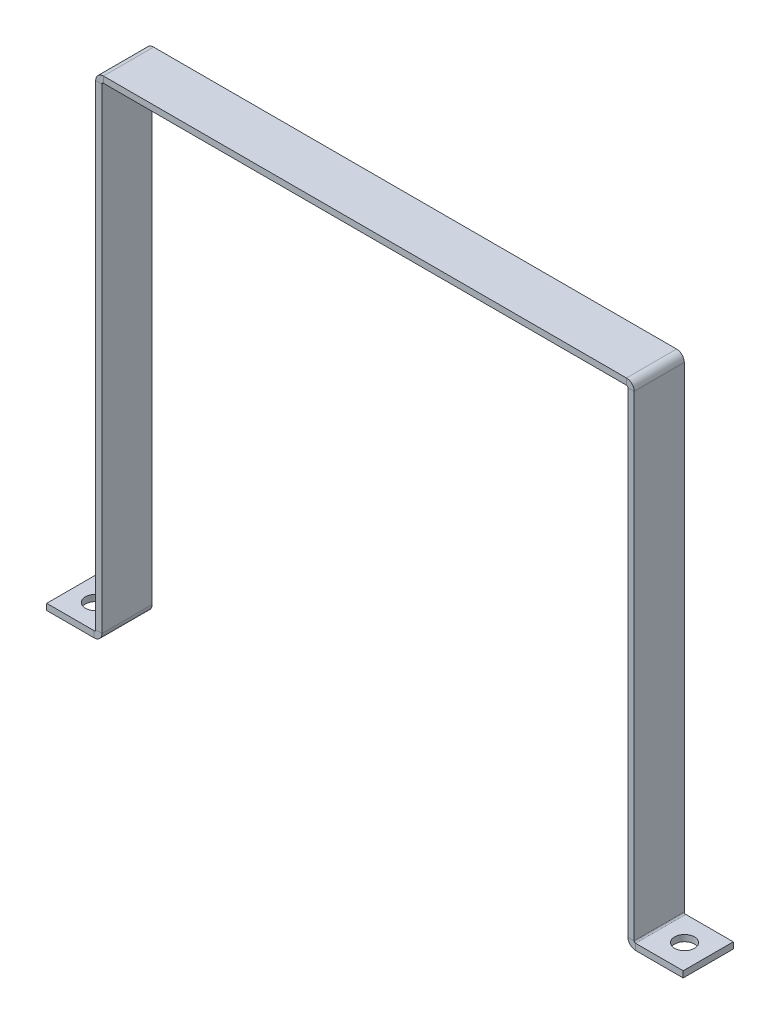
ISO-10303-21;
HEADER;
FILE_DESCRIPTION(('STEP AP214'),'2;1');
FILE_NAME('part.step','',(''),(''),'','','');
FILE_SCHEMA(('AUTOMOTIVE_DESIGN { 1 0 10303 214 1 1 1 1 }'));
ENDSEC;
DATA;
#1=APPLICATION_CONTEXT('core data for automotive mechanical design processes');
#2=APPLICATION_PROTOCOL_DEFINITION('international standard','automotive_design',2000,#1);
#3=PRODUCT_CONTEXT('',#1,'mechanical');
#4=PRODUCT('Part','Part','',(#3));
#5=PRODUCT_RELATED_PRODUCT_CATEGORY('part','',(#4));
#6=PRODUCT_DEFINITION_FORMATION('','',#4);
#7=PRODUCT_DEFINITION_CONTEXT('part definition',#1,'design');
#8=PRODUCT_DEFINITION('design','',#6,#7);
#9=PRODUCT_DEFINITION_SHAPE('','',#8);
#10=(LENGTH_UNIT() NAMED_UNIT(*) SI_UNIT(.MILLI.,.METRE.));
#11=(NAMED_UNIT(*) PLANE_ANGLE_UNIT() SI_UNIT($,.RADIAN.));
#12=(NAMED_UNIT(*) SI_UNIT($,.STERADIAN.) SOLID_ANGLE_UNIT());
#13=UNCERTAINTY_MEASURE_WITH_UNIT(LENGTH_MEASURE(1.E-05),#10,'distance_accuracy_value','');
#14=(GEOMETRIC_REPRESENTATION_CONTEXT(3) GLOBAL_UNCERTAINTY_ASSIGNED_CONTEXT((#13)) GLOBAL_UNIT_ASSIGNED_CONTEXT((#10,
#11,#12)) REPRESENTATION_CONTEXT('',''));
#15=CARTESIAN_POINT('',(0.,0.,0.));
#16=DIRECTION('',(0.,0.,1.));
#17=DIRECTION('',(1.,0.,0.));
#18=AXIS2_PLACEMENT_3D('',#15,#16,#17);
#19=CARTESIAN_POINT('',(-76.0798872180451,-3.175,25.4));
#20=DIRECTION('',(0.,1.,0.));
#21=DIRECTION('',(0.,0.,1.));
#22=AXIS2_PLACEMENT_3D('',#19,#20,#21);
#23=PLANE('',#22);
#24=DIRECTION('',(1.,0.,0.));
#25=VECTOR('',#24,1.);
#26=CARTESIAN_POINT('',(-76.0798872180451,-3.175,0.));
#27=LINE('',#26,#25);
#28=CARTESIAN_POINT('',(-76.0798872180451,-3.175,0.));
#29=VERTEX_POINT('',#28);
#30=CARTESIAN_POINT('',(188.920112781955,-3.17500000000001,0.));
#31=VERTEX_POINT('',#30);
#32=EDGE_CURVE('E221',#29,#31,#27,.T.);
#33=ORIENTED_EDGE('',*,*,#32,.T.);
#34=DIRECTION('',(0.,0.,-1.));
#35=VECTOR('',#34,1.);
#36=CARTESIAN_POINT('',(188.920112781955,-3.175,25.4));
#37=LINE('',#36,#35);
#38=CARTESIAN_POINT('',(188.920112781955,-3.17500000000001,25.4));
#39=VERTEX_POINT('',#38);
#40=EDGE_CURVE('E13',#39,#31,#37,.T.);
#41=ORIENTED_EDGE('',*,*,#40,.F.);
#42=DIRECTION('',(1.,0.,0.));
#43=VECTOR('',#42,1.);
#44=CARTESIAN_POINT('',(-76.0798872180451,-3.175,25.4));
#45=LINE('',#44,#43);
#46=CARTESIAN_POINT('',(-76.0798872180451,-3.175,25.4));
#47=VERTEX_POINT('',#46);
#48=EDGE_CURVE('E136',#47,#39,#45,.T.);
#49=ORIENTED_EDGE('',*,*,#48,.F.);
#50=DIRECTION('',(0.,0.,-1.));
#51=VECTOR('',#50,1.);
#52=CARTESIAN_POINT('',(-76.0798872180451,-3.175,25.4));
#53=LINE('',#52,#51);
#54=EDGE_CURVE('E234',#47,#29,#53,.T.);
#55=ORIENTED_EDGE('',*,*,#54,.T.);
#56=EDGE_LOOP('',(#33,#41,#49,#55));
#57=FACE_BOUND('',#56,.T.);
#58=ADVANCED_FACE('F120',(#57),#23,.F.);
#59=CARTESIAN_POINT('',(-76.0798872180451,0.,25.4));
#60=DIRECTION('',(0.,1.,0.));
#61=DIRECTION('',(0.,0.,1.));
#62=AXIS2_PLACEMENT_3D('',#59,#60,#61);
#63=PLANE('',#62);
#64=DIRECTION('',(1.,0.,0.));
#65=VECTOR('',#64,1.);
#66=CARTESIAN_POINT('',(-76.0798872180451,0.,0.));
#67=LINE('',#66,#65);
#68=CARTESIAN_POINT('',(-76.0798872180451,0.,0.));
#69=VERTEX_POINT('',#68);
#70=CARTESIAN_POINT('',(188.920112781955,0.,0.));
#71=VERTEX_POINT('',#70);
#72=EDGE_CURVE('E240',#69,#71,#67,.T.);
#73=ORIENTED_EDGE('',*,*,#72,.F.);
#74=DIRECTION('',(0.,0.,-1.));
#75=VECTOR('',#74,1.);
#76=CARTESIAN_POINT('',(-76.0798872180451,0.,25.4));
#77=LINE('',#76,#75);
#78=CARTESIAN_POINT('',(-76.0798872180451,0.,25.4));
#79=VERTEX_POINT('',#78);
#80=EDGE_CURVE('E246',#79,#69,#77,.T.);
#81=ORIENTED_EDGE('',*,*,#80,.F.);
#82=DIRECTION('',(1.,0.,0.));
#83=VECTOR('',#82,1.);
#84=CARTESIAN_POINT('',(-76.0798872180451,0.,25.4));
#85=LINE('',#84,#83);
#86=CARTESIAN_POINT('',(188.920112781955,0.,25.4));
#87=VERTEX_POINT('',#86);
#88=EDGE_CURVE('E228',#79,#87,#85,.T.);
#89=ORIENTED_EDGE('',*,*,#88,.T.);
#90=DIRECTION('',(0.,0.,-1.));
#91=VECTOR('',#90,1.);
#92=CARTESIAN_POINT('',(188.920112781955,0.,25.4));
#93=LINE('',#92,#91);
#94=EDGE_CURVE('E128',#87,#71,#93,.T.);
#95=ORIENTED_EDGE('',*,*,#94,.T.);
#96=EDGE_LOOP('',(#73,#81,#89,#95));
#97=FACE_BOUND('',#96,.T.);
#98=ADVANCED_FACE('F250',(#97),#63,.T.);
#99=CARTESIAN_POINT('',(0.,0.,25.4));
#100=DIRECTION('',(0.,0.,-1.));
#101=DIRECTION('',(-1.,0.,0.));
#102=AXIS2_PLACEMENT_3D('',#99,#100,#101);
#103=PLANE('',#102);
#104=ORIENTED_EDGE('',*,*,#48,.T.);
#105=DIRECTION('',(0.,-1.,0.));
#106=VECTOR('',#105,1.);
#107=CARTESIAN_POINT('',(188.920112781955,0.,25.4));
#108=LINE('',#107,#106);
#109=EDGE_CURVE('E192',#87,#39,#108,.T.);
#110=ORIENTED_EDGE('',*,*,#109,.F.);
#111=ORIENTED_EDGE('',*,*,#88,.F.);
#112=DIRECTION('',(0.,1.,0.));
#113=VECTOR('',#112,1.);
#114=CARTESIAN_POINT('',(-76.0798872180451,-3.175,25.4));
#115=LINE('',#114,#113);
#116=EDGE_CURVE('E231',#47,#79,#115,.T.);
#117=ORIENTED_EDGE('',*,*,#116,.F.);
#118=EDGE_LOOP('',(#104,#110,#111,#117));
#119=FACE_BOUND('',#118,.T.);
#120=ADVANCED_FACE('F337',(#119),#103,.F.);
#121=CARTESIAN_POINT('',(0.,0.,0.));
#122=DIRECTION('',(0.,0.,-1.));
#123=DIRECTION('',(-1.,0.,0.));
#124=AXIS2_PLACEMENT_3D('',#121,#122,#123);
#125=PLANE('',#124);
#126=ORIENTED_EDGE('',*,*,#32,.F.);
#127=DIRECTION('',(0.,1.,0.));
#128=VECTOR('',#127,1.);
#129=CARTESIAN_POINT('',(-76.0798872180451,-3.175,0.));
#130=LINE('',#129,#128);
#131=EDGE_CURVE('E226',#29,#69,#130,.T.);
#132=ORIENTED_EDGE('',*,*,#131,.T.);
#133=ORIENTED_EDGE('',*,*,#72,.T.);
#134=DIRECTION('',(0.,-1.,0.));
#135=VECTOR('',#134,1.);
#136=CARTESIAN_POINT('',(188.920112781955,0.,0.));
#137=LINE('',#136,#135);
#138=EDGE_CURVE('E237',#71,#31,#137,.T.);
#139=ORIENTED_EDGE('',*,*,#138,.T.);
#140=EDGE_LOOP('',(#126,#132,#133,#139));
#141=FACE_BOUND('',#140,.T.);
#142=ADVANCED_FACE('F255',(#141),#125,.T.);
#143=CARTESIAN_POINT('',(188.920112781955,-3.91160000000002,0.));
#144=DIRECTION('',(0.,0.,-1.));
#145=DIRECTION('',(-1.,0.,0.));
#146=AXIS2_PLACEMENT_3D('',#143,#144,#145);
#147=PLANE('',#146);
#148=DIRECTION('',(-1.,0.,0.));
#149=VECTOR('',#148,1.);
#150=CARTESIAN_POINT('',(192.831712781955,-3.9116,0.));
#151=LINE('',#150,#149);
#152=CARTESIAN_POINT('',(189.656712781955,-3.91160000000002,0.));
#153=VERTEX_POINT('',#152);
#154=CARTESIAN_POINT('',(192.831712781955,-3.9116,0.));
#155=VERTEX_POINT('',#154);
#156=EDGE_CURVE('E183',#153,#155,#151,.F.);
#157=ORIENTED_EDGE('',*,*,#156,.F.);
#158=CARTESIAN_POINT('',(188.920112781955,-3.91160000000002,0.));
#159=DIRECTION('',(0.,0.,1.));
#160=DIRECTION('',(1.,0.,0.));
#161=AXIS2_PLACEMENT_3D('',#158,#159,#160);
#162=CIRCLE('',#161,0.736600000000004);
#163=EDGE_CURVE('E177',#31,#153,#162,.F.);
#164=ORIENTED_EDGE('',*,*,#163,.F.);
#165=ORIENTED_EDGE('',*,*,#138,.F.);
#166=CARTESIAN_POINT('',(188.920112781955,-3.91160000000002,0.));
#167=DIRECTION('',(0.,0.,1.));
#168=DIRECTION('',(1.,0.,0.));
#169=AXIS2_PLACEMENT_3D('',#166,#167,#168);
#170=CIRCLE('',#169,3.9116);
#171=EDGE_CURVE('E148',#71,#155,#170,.F.);
#172=ORIENTED_EDGE('',*,*,#171,.T.);
#173=EDGE_LOOP('',(#157,#164,#165,#172));
#174=FACE_BOUND('',#173,.T.);
#175=ADVANCED_FACE('F339',(#174),#147,.T.);
#176=CARTESIAN_POINT('',(188.920112781955,-3.91160000000002,25.4));
#177=DIRECTION('',(0.,0.,-1.));
#178=DIRECTION('',(-1.,0.,0.));
#179=AXIS2_PLACEMENT_3D('',#176,#177,#178);
#180=PLANE('',#179);
#181=CARTESIAN_POINT('',(188.920112781955,-3.91160000000002,25.4));
#182=DIRECTION('',(0.,0.,1.));
#183=DIRECTION('',(1.,0.,0.));
#184=AXIS2_PLACEMENT_3D('',#181,#182,#183);
#185=CIRCLE('',#184,0.736600000000004);
#186=CARTESIAN_POINT('',(189.656712781955,-3.91160000000002,25.4));
#187=VERTEX_POINT('',#186);
#188=EDGE_CURVE('E175',#187,#39,#185,.T.);
#189=ORIENTED_EDGE('',*,*,#188,.F.);
#190=DIRECTION('',(-1.,0.,0.));
#191=VECTOR('',#190,1.);
#192=CARTESIAN_POINT('',(189.656712781955,-3.91160000000002,25.4));
#193=LINE('',#192,#191);
#194=CARTESIAN_POINT('',(192.831712781955,-3.9116,25.4));
#195=VERTEX_POINT('',#194);
#196=EDGE_CURVE('E182',#187,#195,#193,.F.);
#197=ORIENTED_EDGE('',*,*,#196,.T.);
#198=CARTESIAN_POINT('',(188.920112781955,-3.91160000000002,25.4));
#199=DIRECTION('',(0.,0.,1.));
#200=DIRECTION('',(1.,0.,0.));
#201=AXIS2_PLACEMENT_3D('',#198,#199,#200);
#202=CIRCLE('',#201,3.9116);
#203=EDGE_CURVE('E222',#195,#87,#202,.T.);
#204=ORIENTED_EDGE('',*,*,#203,.T.);
#205=ORIENTED_EDGE('',*,*,#109,.T.);
#206=EDGE_LOOP('',(#189,#197,#204,#205));
#207=FACE_BOUND('',#206,.T.);
#208=ADVANCED_FACE('F188',(#207),#180,.F.);
#209=CARTESIAN_POINT('',(188.920112781955,-3.91160000000002,25.4));
#210=DIRECTION('',(0.,0.,1.));
#211=DIRECTION('',(1.,0.,0.));
#212=AXIS2_PLACEMENT_3D('',#209,#210,#211);
#213=CYLINDRICAL_SURFACE('',#212,3.9116);
#214=ORIENTED_EDGE('',*,*,#94,.F.);
#215=ORIENTED_EDGE('',*,*,#203,.F.);
#216=DIRECTION('',(0.,0.,1.));
#217=VECTOR('',#216,1.);
#218=CARTESIAN_POINT('',(192.831712781955,-3.9116,0.));
#219=LINE('',#218,#217);
#220=EDGE_CURVE('E205',#195,#155,#219,.F.);
#221=ORIENTED_EDGE('',*,*,#220,.T.);
#222=ORIENTED_EDGE('',*,*,#171,.F.);
#223=EDGE_LOOP('',(#214,#215,#221,#222));
#224=FACE_BOUND('',#223,.T.);
#225=ADVANCED_FACE('F335',(#224),#213,.T.);
#226=CARTESIAN_POINT('',(188.920112781955,-3.91160000000002,25.4));
#227=DIRECTION('',(0.,0.,1.));
#228=DIRECTION('',(1.,0.,0.));
#229=AXIS2_PLACEMENT_3D('',#226,#227,#228);
#230=CYLINDRICAL_SURFACE('',#229,0.736600000000004);
#231=ORIENTED_EDGE('',*,*,#40,.T.);
#232=ORIENTED_EDGE('',*,*,#163,.T.);
#233=DIRECTION('',(0.,0.,1.));
#234=VECTOR('',#233,1.);
#235=CARTESIAN_POINT('',(189.656712781955,-3.91160000000002,0.));
#236=LINE('',#235,#234);
#237=EDGE_CURVE('E172',#153,#187,#236,.T.);
#238=ORIENTED_EDGE('',*,*,#237,.T.);
#239=ORIENTED_EDGE('',*,*,#188,.T.);
#240=EDGE_LOOP('',(#231,#232,#238,#239));
#241=FACE_BOUND('',#240,.T.);
#242=ADVANCED_FACE('F174',(#241),#230,.F.);
#243=CARTESIAN_POINT('',(192.831712781956,-245.,25.4));
#244=DIRECTION('',(0.,0.,-1.));
#245=DIRECTION('',(0.,1.,0.));
#246=AXIS2_PLACEMENT_3D('',#243,#244,#245);
#247=PLANE('',#246);
#248=ORIENTED_EDGE('',*,*,#196,.F.);
#249=DIRECTION('',(0.,1.,0.));
#250=VECTOR('',#249,1.);
#251=CARTESIAN_POINT('',(189.656712781956,-245.,25.4));
#252=LINE('',#251,#250);
#253=CARTESIAN_POINT('',(189.656712781956,-245.,25.4));
#254=VERTEX_POINT('',#253);
#255=EDGE_CURVE('E201',#187,#254,#252,.F.);
#256=ORIENTED_EDGE('',*,*,#255,.T.);
#257=DIRECTION('',(-1.,0.,0.));
#258=VECTOR('',#257,1.);
#259=CARTESIAN_POINT('',(192.831712781956,-245.,25.4));
#260=LINE('',#259,#258);
#261=CARTESIAN_POINT('',(192.831712781956,-245.,25.4));
#262=VERTEX_POINT('',#261);
#263=EDGE_CURVE('E193',#262,#254,#260,.T.);
#264=ORIENTED_EDGE('',*,*,#263,.F.);
#265=DIRECTION('',(0.,-1.,0.));
#266=VECTOR('',#265,1.);
#267=CARTESIAN_POINT('',(192.831712781955,6.59400766198219E-13,25.4));
#268=LINE('',#267,#266);
#269=EDGE_CURVE('E204',#195,#262,#268,.T.);
#270=ORIENTED_EDGE('',*,*,#269,.F.);
#271=EDGE_LOOP('',(#248,#256,#264,#270));
#272=FACE_BOUND('',#271,.T.);
#273=ADVANCED_FACE('F198',(#272),#247,.F.);
#274=CARTESIAN_POINT('',(192.831712781955,-3.17499999999999,0.));
#275=DIRECTION('',(0.,0.,1.));
#276=DIRECTION('',(1.,0.,0.));
#277=AXIS2_PLACEMENT_3D('',#274,#275,#276);
#278=PLANE('',#277);
#279=ORIENTED_EDGE('',*,*,#156,.T.);
#280=DIRECTION('',(0.,1.,0.));
#281=VECTOR('',#280,1.);
#282=CARTESIAN_POINT('',(192.831712781955,6.61587238711307E-13,0.));
#283=LINE('',#282,#281);
#284=CARTESIAN_POINT('',(192.831712781956,-245.,0.));
#285=VERTEX_POINT('',#284);
#286=EDGE_CURVE('E291',#285,#155,#283,.T.);
#287=ORIENTED_EDGE('',*,*,#286,.F.);
#288=DIRECTION('',(-1.,0.,0.));
#289=VECTOR('',#288,1.);
#290=CARTESIAN_POINT('',(192.831712781956,-245.,0.));
#291=LINE('',#290,#289);
#292=CARTESIAN_POINT('',(189.656712781956,-245.,0.));
#293=VERTEX_POINT('',#292);
#294=EDGE_CURVE('E288',#285,#293,#291,.T.);
#295=ORIENTED_EDGE('',*,*,#294,.T.);
#296=DIRECTION('',(0.,-1.,0.));
#297=VECTOR('',#296,1.);
#298=CARTESIAN_POINT('',(189.656712781955,-3.175,0.));
#299=LINE('',#298,#297);
#300=EDGE_CURVE('E212',#293,#153,#299,.F.);
#301=ORIENTED_EDGE('',*,*,#300,.T.);
#302=EDGE_LOOP('',(#279,#287,#295,#301));
#303=FACE_BOUND('',#302,.T.);
#304=ADVANCED_FACE('F298',(#303),#278,.F.);
#305=CARTESIAN_POINT('',(192.831712781955,6.61587238711307E-13,0.));
#306=DIRECTION('',(-1.,0.,0.));
#307=DIRECTION('',(0.,-1.,0.));
#308=AXIS2_PLACEMENT_3D('',#305,#306,#307);
#309=PLANE('',#308);
#310=ORIENTED_EDGE('',*,*,#220,.F.);
#311=ORIENTED_EDGE('',*,*,#269,.T.);
#312=DIRECTION('',(0.,0.,-1.));
#313=VECTOR('',#312,1.);
#314=CARTESIAN_POINT('',(192.831712781956,-245.,0.));
#315=LINE('',#314,#313);
#316=EDGE_CURVE('E294',#262,#285,#315,.T.);
#317=ORIENTED_EDGE('',*,*,#316,.T.);
#318=ORIENTED_EDGE('',*,*,#286,.T.);
#319=EDGE_LOOP('',(#310,#311,#317,#318));
#320=FACE_BOUND('',#319,.T.);
#321=ADVANCED_FACE('F456',(#320),#309,.F.);
#322=CARTESIAN_POINT('',(189.656712781955,6.50501785460481E-13,0.));
#323=DIRECTION('',(-1.,0.,0.));
#324=DIRECTION('',(0.,-1.,0.));
#325=AXIS2_PLACEMENT_3D('',#322,#323,#324);
#326=PLANE('',#325);
#327=ORIENTED_EDGE('',*,*,#255,.F.);
#328=ORIENTED_EDGE('',*,*,#237,.F.);
#329=ORIENTED_EDGE('',*,*,#300,.F.);
#330=DIRECTION('',(0.,0.,1.));
#331=VECTOR('',#330,1.);
#332=CARTESIAN_POINT('',(189.656712781956,-245.,0.));
#333=LINE('',#332,#331);
#334=EDGE_CURVE('E209',#254,#293,#333,.F.);
#335=ORIENTED_EDGE('',*,*,#334,.F.);
#336=EDGE_LOOP('',(#327,#328,#329,#335));
#337=FACE_BOUND('',#336,.T.);
#338=ADVANCED_FACE('F207',(#337),#326,.T.);
#339=CARTESIAN_POINT('',(-76.0798872180451,-3.9116,25.4));
#340=DIRECTION('',(0.,0.,1.));
#341=DIRECTION('',(1.,0.,0.));
#342=AXIS2_PLACEMENT_3D('',#339,#340,#341);
#343=PLANE('',#342);
#344=DIRECTION('',(1.,0.,0.));
#345=VECTOR('',#344,1.);
#346=CARTESIAN_POINT('',(-79.9914872180451,-3.91159999999999,25.4));
#347=LINE('',#346,#345);
#348=CARTESIAN_POINT('',(-76.8164872180451,-3.9116,25.4));
#349=VERTEX_POINT('',#348);
#350=CARTESIAN_POINT('',(-79.9914872180451,-3.91159999999999,25.4));
#351=VERTEX_POINT('',#350);
#352=EDGE_CURVE('E839',#349,#351,#347,.F.);
#353=ORIENTED_EDGE('',*,*,#352,.F.);
#354=CARTESIAN_POINT('',(-76.0798872180451,-3.9116,25.4));
#355=DIRECTION('',(0.,0.,-1.));
#356=DIRECTION('',(-1.,0.,0.));
#357=AXIS2_PLACEMENT_3D('',#354,#355,#356);
#358=CIRCLE('',#357,0.736600000000004);
#359=EDGE_CURVE('E278',#47,#349,#358,.F.);
#360=ORIENTED_EDGE('',*,*,#359,.F.);
#361=ORIENTED_EDGE('',*,*,#116,.T.);
#362=CARTESIAN_POINT('',(-76.0798872180451,-3.9116,25.4));
#363=DIRECTION('',(0.,0.,-1.));
#364=DIRECTION('',(-1.,0.,0.));
#365=AXIS2_PLACEMENT_3D('',#362,#363,#364);
#366=CIRCLE('',#365,3.9116);
#367=EDGE_CURVE('E219',#79,#351,#366,.F.);
#368=ORIENTED_EDGE('',*,*,#367,.T.);
#369=EDGE_LOOP('',(#353,#360,#361,#368));
#370=FACE_BOUND('',#369,.T.);
#371=ADVANCED_FACE('F400',(#370),#343,.T.);
#372=CARTESIAN_POINT('',(-76.0798872180451,-3.9116,0.));
#373=DIRECTION('',(0.,0.,1.));
#374=DIRECTION('',(1.,0.,0.));
#375=AXIS2_PLACEMENT_3D('',#372,#373,#374);
#376=PLANE('',#375);
#377=CARTESIAN_POINT('',(-76.0798872180451,-3.9116,0.));
#378=DIRECTION('',(0.,0.,-1.));
#379=DIRECTION('',(-1.,0.,0.));
#380=AXIS2_PLACEMENT_3D('',#377,#378,#379);
#381=CIRCLE('',#380,0.736600000000004);
#382=CARTESIAN_POINT('',(-76.8164872180451,-3.9116,0.));
#383=VERTEX_POINT('',#382);
#384=EDGE_CURVE('E266',#383,#29,#381,.T.);
#385=ORIENTED_EDGE('',*,*,#384,.F.);
#386=DIRECTION('',(1.,0.,0.));
#387=VECTOR('',#386,1.);
#388=CARTESIAN_POINT('',(-76.8164872180451,-3.9116,0.));
#389=LINE('',#388,#387);
#390=CARTESIAN_POINT('',(-79.9914872180451,-3.91159999999999,0.));
#391=VERTEX_POINT('',#390);
#392=EDGE_CURVE('E867',#383,#391,#389,.F.);
#393=ORIENTED_EDGE('',*,*,#392,.T.);
#394=CARTESIAN_POINT('',(-76.0798872180451,-3.9116,0.));
#395=DIRECTION('',(0.,0.,-1.));
#396=DIRECTION('',(-1.,0.,0.));
#397=AXIS2_PLACEMENT_3D('',#394,#395,#396);
#398=CIRCLE('',#397,3.9116);
#399=EDGE_CURVE('E269',#391,#69,#398,.T.);
#400=ORIENTED_EDGE('',*,*,#399,.T.);
#401=ORIENTED_EDGE('',*,*,#131,.F.);
#402=EDGE_LOOP('',(#385,#393,#400,#401));
#403=FACE_BOUND('',#402,.T.);
#404=ADVANCED_FACE('F263',(#403),#376,.F.);
#405=CARTESIAN_POINT('',(-76.0798872180451,-3.9116,0.));
#406=DIRECTION('',(0.,0.,-1.));
#407=DIRECTION('',(-1.,0.,0.));
#408=AXIS2_PLACEMENT_3D('',#405,#406,#407);
#409=CYLINDRICAL_SURFACE('',#408,3.9116);
#410=ORIENTED_EDGE('',*,*,#80,.T.);
#411=ORIENTED_EDGE('',*,*,#399,.F.);
#412=DIRECTION('',(0.,0.,-1.));
#413=VECTOR('',#412,1.);
#414=CARTESIAN_POINT('',(-79.9914872180451,-3.91159999999999,25.4));
#415=LINE('',#414,#413);
#416=EDGE_CURVE('E865',#391,#351,#415,.F.);
#417=ORIENTED_EDGE('',*,*,#416,.T.);
#418=ORIENTED_EDGE('',*,*,#367,.F.);
#419=EDGE_LOOP('',(#410,#411,#417,#418));
#420=FACE_BOUND('',#419,.T.);
#421=ADVANCED_FACE('F417',(#420),#409,.T.);
#422=CARTESIAN_POINT('',(-76.0798872180451,-3.9116,0.));
#423=DIRECTION('',(0.,0.,-1.));
#424=DIRECTION('',(-1.,0.,0.));
#425=AXIS2_PLACEMENT_3D('',#422,#423,#424);
#426=CYLINDRICAL_SURFACE('',#425,0.736600000000004);
#427=ORIENTED_EDGE('',*,*,#54,.F.);
#428=ORIENTED_EDGE('',*,*,#359,.T.);
#429=DIRECTION('',(0.,0.,-1.));
#430=VECTOR('',#429,1.);
#431=CARTESIAN_POINT('',(-76.8164872180451,-3.9116,25.4));
#432=LINE('',#431,#430);
#433=EDGE_CURVE('E277',#349,#383,#432,.T.);
#434=ORIENTED_EDGE('',*,*,#433,.T.);
#435=ORIENTED_EDGE('',*,*,#384,.T.);
#436=EDGE_LOOP('',(#427,#428,#434,#435));
#437=FACE_BOUND('',#436,.T.);
#438=ADVANCED_FACE('F273',(#437),#426,.F.);
#439=CARTESIAN_POINT('',(-79.9914872180451,-3.17499999999999,25.4));
#440=DIRECTION('',(0.,0.,-1.));
#441=DIRECTION('',(-1.,0.,0.));
#442=AXIS2_PLACEMENT_3D('',#439,#440,#441);
#443=PLANE('',#442);
#444=ORIENTED_EDGE('',*,*,#352,.T.);
#445=DIRECTION('',(0.,1.,0.));
#446=VECTOR('',#445,1.);
#447=CARTESIAN_POINT('',(-79.9914872180451,2.77414626853736E-13,25.4));
#448=LINE('',#447,#446);
#449=CARTESIAN_POINT('',(-79.991487218046,-245.,25.4));
#450=VERTEX_POINT('',#449);
#451=EDGE_CURVE('E854',#450,#351,#448,.T.);
#452=ORIENTED_EDGE('',*,*,#451,.F.);
#453=DIRECTION('',(1.,0.,0.));
#454=VECTOR('',#453,1.);
#455=CARTESIAN_POINT('',(-79.991487218046,-245.,25.4));
#456=LINE('',#455,#454);
#457=CARTESIAN_POINT('',(-76.816487218046,-245.,25.4));
#458=VERTEX_POINT('',#457);
#459=EDGE_CURVE('E283',#450,#458,#456,.T.);
#460=ORIENTED_EDGE('',*,*,#459,.T.);
#461=DIRECTION('',(0.,-1.,0.));
#462=VECTOR('',#461,1.);
#463=CARTESIAN_POINT('',(-76.8164872180451,-3.175,25.4));
#464=LINE('',#463,#462);
#465=EDGE_CURVE('E862',#458,#349,#464,.F.);
#466=ORIENTED_EDGE('',*,*,#465,.T.);
#467=EDGE_LOOP('',(#444,#452,#460,#466));
#468=FACE_BOUND('',#467,.T.);
#469=ADVANCED_FACE('F437',(#468),#443,.F.);
#470=CARTESIAN_POINT('',(-79.991487218046,-245.,0.));
#471=DIRECTION('',(0.,0.,1.));
#472=DIRECTION('',(1.,0.,0.));
#473=AXIS2_PLACEMENT_3D('',#470,#471,#472);
#474=PLANE('',#473);
#475=ORIENTED_EDGE('',*,*,#392,.F.);
#476=DIRECTION('',(0.,1.,0.));
#477=VECTOR('',#476,1.);
#478=CARTESIAN_POINT('',(-76.816487218046,-245.,0.));
#479=LINE('',#478,#477);
#480=CARTESIAN_POINT('',(-76.816487218046,-245.,0.));
#481=VERTEX_POINT('',#480);
#482=EDGE_CURVE('E860',#383,#481,#479,.F.);
#483=ORIENTED_EDGE('',*,*,#482,.T.);
#484=DIRECTION('',(1.,0.,0.));
#485=VECTOR('',#484,1.);
#486=CARTESIAN_POINT('',(-79.991487218046,-245.,0.));
#487=LINE('',#486,#485);
#488=CARTESIAN_POINT('',(-79.991487218046,-245.,0.));
#489=VERTEX_POINT('',#488);
#490=EDGE_CURVE('E279',#489,#481,#487,.T.);
#491=ORIENTED_EDGE('',*,*,#490,.F.);
#492=DIRECTION('',(0.,-1.,0.));
#493=VECTOR('',#492,1.);
#494=CARTESIAN_POINT('',(-79.9914872180451,2.77414626853736E-13,0.));
#495=LINE('',#494,#493);
#496=EDGE_CURVE('E852',#391,#489,#495,.T.);
#497=ORIENTED_EDGE('',*,*,#496,.F.);
#498=EDGE_LOOP('',(#475,#483,#491,#497));
#499=FACE_BOUND('',#498,.T.);
#500=ADVANCED_FACE('F481',(#499),#474,.F.);
#501=CARTESIAN_POINT('',(-79.9914872180451,2.77414626853736E-13,0.));
#502=DIRECTION('',(1.,0.,0.));
#503=DIRECTION('',(0.,1.,0.));
#504=AXIS2_PLACEMENT_3D('',#501,#502,#503);
#505=PLANE('',#504);
#506=ORIENTED_EDGE('',*,*,#416,.F.);
#507=ORIENTED_EDGE('',*,*,#496,.T.);
#508=DIRECTION('',(0.,0.,1.));
#509=VECTOR('',#508,1.);
#510=CARTESIAN_POINT('',(-79.991487218046,-245.,0.));
#511=LINE('',#510,#509);
#512=EDGE_CURVE('E850',#489,#450,#511,.T.);
#513=ORIENTED_EDGE('',*,*,#512,.T.);
#514=ORIENTED_EDGE('',*,*,#451,.T.);
#515=EDGE_LOOP('',(#506,#507,#513,#514));
#516=FACE_BOUND('',#515,.T.);
#517=ADVANCED_FACE('F492',(#516),#505,.F.);
#518=CARTESIAN_POINT('',(-76.8164872180451,2.6632917360291E-13,0.));
#519=DIRECTION('',(1.,0.,0.));
#520=DIRECTION('',(0.,1.,0.));
#521=AXIS2_PLACEMENT_3D('',#518,#519,#520);
#522=PLANE('',#521);
#523=ORIENTED_EDGE('',*,*,#482,.F.);
#524=ORIENTED_EDGE('',*,*,#433,.F.);
#525=ORIENTED_EDGE('',*,*,#465,.F.);
#526=DIRECTION('',(0.,0.,-1.));
#527=VECTOR('',#526,1.);
#528=CARTESIAN_POINT('',(-76.816487218046,-245.,25.4));
#529=LINE('',#528,#527);
#530=EDGE_CURVE('E857',#481,#458,#529,.F.);
#531=ORIENTED_EDGE('',*,*,#530,.F.);
#532=EDGE_LOOP('',(#523,#524,#525,#531));
#533=FACE_BOUND('',#532,.T.);
#534=ADVANCED_FACE('F503',(#533),#522,.T.);
#535=CARTESIAN_POINT('',(193.568312781956,-245.,25.4));
#536=DIRECTION('',(0.,0.,1.));
#537=DIRECTION('',(1.,0.,0.));
#538=AXIS2_PLACEMENT_3D('',#535,#536,#537);
#539=PLANE('',#538);
#540=DIRECTION('',(0.,1.,0.));
#541=VECTOR('',#540,1.);
#542=CARTESIAN_POINT('',(193.568312781956,-248.9116,25.4));
#543=LINE('',#542,#541);
#544=CARTESIAN_POINT('',(193.568312781956,-245.7366,25.4));
#545=VERTEX_POINT('',#544);
#546=CARTESIAN_POINT('',(193.568312781956,-248.9116,25.4));
#547=VERTEX_POINT('',#546);
#548=EDGE_CURVE('E793',#545,#547,#543,.F.);
#549=ORIENTED_EDGE('',*,*,#548,.F.);
#550=CARTESIAN_POINT('',(193.568312781956,-245.,25.4));
#551=DIRECTION('',(0.,0.,-1.));
#552=DIRECTION('',(-1.,0.,0.));
#553=AXIS2_PLACEMENT_3D('',#550,#551,#552);
#554=CIRCLE('',#553,0.736600000000004);
#555=EDGE_CURVE('E843',#262,#545,#554,.F.);
#556=ORIENTED_EDGE('',*,*,#555,.F.);
#557=ORIENTED_EDGE('',*,*,#263,.T.);
#558=CARTESIAN_POINT('',(193.568312781956,-245.,25.4));
#559=DIRECTION('',(0.,0.,-1.));
#560=DIRECTION('',(-1.,0.,0.));
#561=AXIS2_PLACEMENT_3D('',#558,#559,#560);
#562=CIRCLE('',#561,3.9116);
#563=EDGE_CURVE('E836',#254,#547,#562,.F.);
#564=ORIENTED_EDGE('',*,*,#563,.T.);
#565=EDGE_LOOP('',(#549,#556,#557,#564));
#566=FACE_BOUND('',#565,.T.);
#567=ADVANCED_FACE('F514',(#566),#539,.T.);
#568=CARTESIAN_POINT('',(193.568312781956,-245.,0.));
#569=DIRECTION('',(0.,0.,1.));
#570=DIRECTION('',(1.,0.,0.));
#571=AXIS2_PLACEMENT_3D('',#568,#569,#570);
#572=PLANE('',#571);
#573=CARTESIAN_POINT('',(193.568312781956,-245.,0.));
#574=DIRECTION('',(0.,0.,-1.));
#575=DIRECTION('',(-1.,0.,0.));
#576=AXIS2_PLACEMENT_3D('',#573,#574,#575);
#577=CIRCLE('',#576,0.736600000000004);
#578=CARTESIAN_POINT('',(193.568312781956,-245.7366,0.));
#579=VERTEX_POINT('',#578);
#580=EDGE_CURVE('E805',#579,#285,#577,.T.);
#581=ORIENTED_EDGE('',*,*,#580,.F.);
#582=DIRECTION('',(0.,1.,0.));
#583=VECTOR('',#582,1.);
#584=CARTESIAN_POINT('',(193.568312781956,-245.7366,0.));
#585=LINE('',#584,#583);
#586=CARTESIAN_POINT('',(193.568312781956,-248.9116,0.));
#587=VERTEX_POINT('',#586);
#588=EDGE_CURVE('E829',#579,#587,#585,.F.);
#589=ORIENTED_EDGE('',*,*,#588,.T.);
#590=CARTESIAN_POINT('',(193.568312781956,-245.,0.));
#591=DIRECTION('',(0.,0.,-1.));
#592=DIRECTION('',(-1.,0.,0.));
#593=AXIS2_PLACEMENT_3D('',#590,#591,#592);
#594=CIRCLE('',#593,3.9116);
#595=EDGE_CURVE('E840',#587,#293,#594,.T.);
#596=ORIENTED_EDGE('',*,*,#595,.T.);
#597=ORIENTED_EDGE('',*,*,#294,.F.);
#598=EDGE_LOOP('',(#581,#589,#596,#597));
#599=FACE_BOUND('',#598,.T.);
#600=ADVANCED_FACE('F525',(#599),#572,.F.);
#601=CARTESIAN_POINT('',(193.568312781956,-245.,0.));
#602=DIRECTION('',(0.,0.,-1.));
#603=DIRECTION('',(0.,-1.,0.));
#604=AXIS2_PLACEMENT_3D('',#601,#602,#603);
#605=CYLINDRICAL_SURFACE('',#604,3.9116);
#606=ORIENTED_EDGE('',*,*,#334,.T.);
#607=ORIENTED_EDGE('',*,*,#595,.F.);
#608=DIRECTION('',(0.,0.,-1.));
#609=VECTOR('',#608,1.);
#610=CARTESIAN_POINT('',(193.568312781956,-248.9116,25.4));
#611=LINE('',#610,#609);
#612=EDGE_CURVE('E827',#587,#547,#611,.F.);
#613=ORIENTED_EDGE('',*,*,#612,.T.);
#614=ORIENTED_EDGE('',*,*,#563,.F.);
#615=EDGE_LOOP('',(#606,#607,#613,#614));
#616=FACE_BOUND('',#615,.T.);
#617=ADVANCED_FACE('F536',(#616),#605,.T.);
#618=CARTESIAN_POINT('',(193.568312781956,-245.,0.));
#619=DIRECTION('',(0.,0.,-1.));
#620=DIRECTION('',(0.,-1.,0.));
#621=AXIS2_PLACEMENT_3D('',#618,#619,#620);
#622=CYLINDRICAL_SURFACE('',#621,0.736600000000004);
#623=ORIENTED_EDGE('',*,*,#316,.F.);
#624=ORIENTED_EDGE('',*,*,#555,.T.);
#625=DIRECTION('',(0.,0.,-1.));
#626=VECTOR('',#625,1.);
#627=CARTESIAN_POINT('',(193.568312781956,-245.7366,25.4));
#628=LINE('',#627,#626);
#629=EDGE_CURVE('E832',#545,#579,#628,.T.);
#630=ORIENTED_EDGE('',*,*,#629,.T.);
#631=ORIENTED_EDGE('',*,*,#580,.T.);
#632=EDGE_LOOP('',(#623,#624,#630,#631));
#633=FACE_BOUND('',#632,.T.);
#634=ADVANCED_FACE('F547',(#633),#622,.F.);
#635=CARTESIAN_POINT('',(217.656712781956,-248.9116,0.));
#636=DIRECTION('',(0.,0.,1.));
#637=DIRECTION('',(1.,0.,0.));
#638=AXIS2_PLACEMENT_3D('',#635,#636,#637);
#639=PLANE('',#638);
#640=ORIENTED_EDGE('',*,*,#588,.F.);
#641=DIRECTION('',(-1.,0.,0.));
#642=VECTOR('',#641,1.);
#643=CARTESIAN_POINT('',(217.656712781956,-245.7366,0.));
#644=LINE('',#643,#642);
#645=CARTESIAN_POINT('',(217.656712781956,-245.7366,0.));
#646=VERTEX_POINT('',#645);
#647=EDGE_CURVE('E824',#579,#646,#644,.F.);
#648=ORIENTED_EDGE('',*,*,#647,.T.);
#649=DIRECTION('',(0.,1.,0.));
#650=VECTOR('',#649,1.);
#651=CARTESIAN_POINT('',(217.656712781956,-248.9116,0.));
#652=LINE('',#651,#650);
#653=CARTESIAN_POINT('',(217.656712781956,-248.9116,0.));
#654=VERTEX_POINT('',#653);
#655=EDGE_CURVE('E802',#654,#646,#652,.T.);
#656=ORIENTED_EDGE('',*,*,#655,.F.);
#657=DIRECTION('',(1.,0.,0.));
#658=VECTOR('',#657,1.);
#659=CARTESIAN_POINT('',(0.,-248.9116,0.));
#660=LINE('',#659,#658);
#661=EDGE_CURVE('E815',#587,#654,#660,.T.);
#662=ORIENTED_EDGE('',*,*,#661,.F.);
#663=EDGE_LOOP('',(#640,#648,#656,#662));
#664=FACE_BOUND('',#663,.T.);
#665=ADVANCED_FACE('F558',(#664),#639,.F.);
#666=CARTESIAN_POINT('',(192.831712781956,-248.9116,25.4));
#667=DIRECTION('',(0.,0.,-1.));
#668=DIRECTION('',(-1.,0.,0.));
#669=AXIS2_PLACEMENT_3D('',#666,#667,#668);
#670=PLANE('',#669);
#671=ORIENTED_EDGE('',*,*,#548,.T.);
#672=DIRECTION('',(-1.,0.,0.));
#673=VECTOR('',#672,1.);
#674=CARTESIAN_POINT('',(0.,-248.9116,25.4));
#675=LINE('',#674,#673);
#676=CARTESIAN_POINT('',(217.656712781956,-248.9116,25.4));
#677=VERTEX_POINT('',#676);
#678=EDGE_CURVE('E809',#677,#547,#675,.T.);
#679=ORIENTED_EDGE('',*,*,#678,.F.);
#680=DIRECTION('',(0.,1.,0.));
#681=VECTOR('',#680,1.);
#682=CARTESIAN_POINT('',(217.656712781956,-248.9116,25.4));
#683=LINE('',#682,#681);
#684=CARTESIAN_POINT('',(217.656712781956,-245.7366,25.4));
#685=VERTEX_POINT('',#684);
#686=EDGE_CURVE('E806',#677,#685,#683,.T.);
#687=ORIENTED_EDGE('',*,*,#686,.T.);
#688=DIRECTION('',(1.,0.,0.));
#689=VECTOR('',#688,1.);
#690=CARTESIAN_POINT('',(192.831712781956,-245.7366,25.4));
#691=LINE('',#690,#689);
#692=EDGE_CURVE('E818',#685,#545,#691,.F.);
#693=ORIENTED_EDGE('',*,*,#692,.T.);
#694=EDGE_LOOP('',(#671,#679,#687,#693));
#695=FACE_BOUND('',#694,.T.);
#696=ADVANCED_FACE('F569',(#695),#670,.F.);
#697=CARTESIAN_POINT('',(0.,-248.9116,0.));
#698=DIRECTION('',(0.,1.,0.));
#699=DIRECTION('',(0.,0.,1.));
#700=AXIS2_PLACEMENT_3D('',#697,#698,#699);
#701=PLANE('',#700);
#702=CARTESIAN_POINT('',(205.656712781956,-248.9116,12.7));
#703=DIRECTION('',(0.,-1.,0.));
#704=DIRECTION('',(0.,0.,-1.));
#705=AXIS2_PLACEMENT_3D('',#702,#703,#704);
#706=CIRCLE('',#705,5.04189999999999);
#707=CARTESIAN_POINT('',(205.656712781956,-248.9116,7.65810000000004));
#708=VERTEX_POINT('',#707);
#709=EDGE_CURVE('E745',#708,#708,#706,.T.);
#710=ORIENTED_EDGE('',*,*,#709,.F.);
#711=EDGE_LOOP('',(#710));
#712=FACE_BOUND('',#711,.T.);
#713=ORIENTED_EDGE('',*,*,#612,.F.);
#714=ORIENTED_EDGE('',*,*,#661,.T.);
#715=DIRECTION('',(0.,0.,1.));
#716=VECTOR('',#715,1.);
#717=CARTESIAN_POINT('',(217.656712781956,-248.9116,0.));
#718=LINE('',#717,#716);
#719=EDGE_CURVE('E812',#654,#677,#718,.T.);
#720=ORIENTED_EDGE('',*,*,#719,.T.);
#721=ORIENTED_EDGE('',*,*,#678,.T.);
#722=EDGE_LOOP('',(#713,#714,#720,#721));
#723=FACE_BOUND('',#722,.T.);
#724=ADVANCED_FACE('F580',(#712,#723),#701,.F.);
#725=CARTESIAN_POINT('',(0.,-245.7366,0.));
#726=DIRECTION('',(0.,1.,0.));
#727=DIRECTION('',(0.,0.,1.));
#728=AXIS2_PLACEMENT_3D('',#725,#726,#727);
#729=PLANE('',#728);
#730=CARTESIAN_POINT('',(205.656712781956,-245.7366,12.7));
#731=DIRECTION('',(0.,1.,0.));
#732=DIRECTION('',(0.,0.,1.));
#733=AXIS2_PLACEMENT_3D('',#730,#731,#732);
#734=CIRCLE('',#733,5.04189999999996);
#735=CARTESIAN_POINT('',(205.656712781956,-245.7366,17.7419));
#736=VERTEX_POINT('',#735);
#737=EDGE_CURVE('E750',#736,#736,#734,.T.);
#738=ORIENTED_EDGE('',*,*,#737,.F.);
#739=EDGE_LOOP('',(#738));
#740=FACE_BOUND('',#739,.T.);
#741=ORIENTED_EDGE('',*,*,#647,.F.);
#742=ORIENTED_EDGE('',*,*,#629,.F.);
#743=ORIENTED_EDGE('',*,*,#692,.F.);
#744=DIRECTION('',(0.,0.,-1.));
#745=VECTOR('',#744,1.);
#746=CARTESIAN_POINT('',(217.656712781956,-245.7366,25.4));
#747=LINE('',#746,#745);
#748=EDGE_CURVE('E821',#646,#685,#747,.F.);
#749=ORIENTED_EDGE('',*,*,#748,.F.);
#750=EDGE_LOOP('',(#741,#742,#743,#749));
#751=FACE_BOUND('',#750,.T.);
#752=ADVANCED_FACE('F595',(#740,#751),#729,.T.);
#753=CARTESIAN_POINT('',(217.656712781956,-248.9116,25.4));
#754=DIRECTION('',(-1.,0.,0.));
#755=DIRECTION('',(0.,-1.,0.));
#756=AXIS2_PLACEMENT_3D('',#753,#754,#755);
#757=PLANE('',#756);
#758=ORIENTED_EDGE('',*,*,#748,.T.);
#759=ORIENTED_EDGE('',*,*,#686,.F.);
#760=ORIENTED_EDGE('',*,*,#719,.F.);
#761=ORIENTED_EDGE('',*,*,#655,.T.);
#762=EDGE_LOOP('',(#758,#759,#760,#761));
#763=FACE_BOUND('',#762,.T.);
#764=ADVANCED_FACE('F589',(#763),#757,.F.);
#765=CARTESIAN_POINT('',(-80.728087218046,-245.,0.));
#766=DIRECTION('',(0.,0.,-1.));
#767=DIRECTION('',(-1.,0.,0.));
#768=AXIS2_PLACEMENT_3D('',#765,#766,#767);
#769=PLANE('',#768);
#770=DIRECTION('',(0.,1.,0.));
#771=VECTOR('',#770,1.);
#772=CARTESIAN_POINT('',(-80.728087218046,-248.9116,0.));
#773=LINE('',#772,#771);
#774=CARTESIAN_POINT('',(-80.728087218046,-245.7366,0.));
#775=VERTEX_POINT('',#774);
#776=CARTESIAN_POINT('',(-80.728087218046,-248.9116,0.));
#777=VERTEX_POINT('',#776);
#778=EDGE_CURVE('E753',#775,#777,#773,.F.);
#779=ORIENTED_EDGE('',*,*,#778,.F.);
#780=CARTESIAN_POINT('',(-80.728087218046,-245.,0.));
#781=DIRECTION('',(0.,0.,1.));
#782=DIRECTION('',(1.,0.,0.));
#783=AXIS2_PLACEMENT_3D('',#780,#781,#782);
#784=CIRCLE('',#783,0.736600000000004);
#785=EDGE_CURVE('E797',#489,#775,#784,.F.);
#786=ORIENTED_EDGE('',*,*,#785,.F.);
#787=ORIENTED_EDGE('',*,*,#490,.T.);
#788=CARTESIAN_POINT('',(-80.728087218046,-245.,0.));
#789=DIRECTION('',(0.,0.,1.));
#790=DIRECTION('',(1.,0.,0.));
#791=AXIS2_PLACEMENT_3D('',#788,#789,#790);
#792=CIRCLE('',#791,3.9116);
#793=EDGE_CURVE('E790',#481,#777,#792,.F.);
#794=ORIENTED_EDGE('',*,*,#793,.T.);
#795=EDGE_LOOP('',(#779,#786,#787,#794));
#796=FACE_BOUND('',#795,.T.);
#797=ADVANCED_FACE('F594',(#796),#769,.T.);
#798=CARTESIAN_POINT('',(-80.728087218046,-245.,25.4));
#799=DIRECTION('',(0.,0.,-1.));
#800=DIRECTION('',(-1.,0.,0.));
#801=AXIS2_PLACEMENT_3D('',#798,#799,#800);
#802=PLANE('',#801);
#803=CARTESIAN_POINT('',(-80.728087218046,-245.,25.4));
#804=DIRECTION('',(0.,0.,1.));
#805=DIRECTION('',(1.,0.,0.));
#806=AXIS2_PLACEMENT_3D('',#803,#804,#805);
#807=CIRCLE('',#806,0.736600000000004);
#808=CARTESIAN_POINT('',(-80.728087218046,-245.7366,25.4));
#809=VERTEX_POINT('',#808);
#810=EDGE_CURVE('E757',#809,#450,#807,.T.);
#811=ORIENTED_EDGE('',*,*,#810,.F.);
#812=DIRECTION('',(0.,1.,0.));
#813=VECTOR('',#812,1.);
#814=CARTESIAN_POINT('',(-80.728087218046,-245.7366,25.4));
#815=LINE('',#814,#813);
#816=CARTESIAN_POINT('',(-80.728087218046,-248.9116,25.4));
#817=VERTEX_POINT('',#816);
#818=EDGE_CURVE('E782',#809,#817,#815,.F.);
#819=ORIENTED_EDGE('',*,*,#818,.T.);
#820=CARTESIAN_POINT('',(-80.728087218046,-245.,25.4));
#821=DIRECTION('',(0.,0.,1.));
#822=DIRECTION('',(1.,0.,0.));
#823=AXIS2_PLACEMENT_3D('',#820,#821,#822);
#824=CIRCLE('',#823,3.9116);
#825=EDGE_CURVE('E794',#817,#458,#824,.T.);
#826=ORIENTED_EDGE('',*,*,#825,.T.);
#827=ORIENTED_EDGE('',*,*,#459,.F.);
#828=EDGE_LOOP('',(#811,#819,#826,#827));
#829=FACE_BOUND('',#828,.T.);
#830=ADVANCED_FACE('F608',(#829),#802,.F.);
#831=CARTESIAN_POINT('',(-80.728087218046,-245.,25.4));
#832=DIRECTION('',(0.,0.,1.));
#833=DIRECTION('',(0.,-1.,0.));
#834=AXIS2_PLACEMENT_3D('',#831,#832,#833);
#835=CYLINDRICAL_SURFACE('',#834,3.9116);
#836=ORIENTED_EDGE('',*,*,#530,.T.);
#837=ORIENTED_EDGE('',*,*,#825,.F.);
#838=DIRECTION('',(0.,0.,1.));
#839=VECTOR('',#838,1.);
#840=CARTESIAN_POINT('',(-80.728087218046,-248.9116,0.));
#841=LINE('',#840,#839);
#842=EDGE_CURVE('E779',#817,#777,#841,.F.);
#843=ORIENTED_EDGE('',*,*,#842,.T.);
#844=ORIENTED_EDGE('',*,*,#793,.F.);
#845=EDGE_LOOP('',(#836,#837,#843,#844));
#846=FACE_BOUND('',#845,.T.);
#847=ADVANCED_FACE('F619',(#846),#835,.T.);
#848=CARTESIAN_POINT('',(-80.728087218046,-245.,25.4));
#849=DIRECTION('',(0.,0.,1.));
#850=DIRECTION('',(0.,-1.,0.));
#851=AXIS2_PLACEMENT_3D('',#848,#849,#850);
#852=CYLINDRICAL_SURFACE('',#851,0.736600000000004);
#853=ORIENTED_EDGE('',*,*,#512,.F.);
#854=ORIENTED_EDGE('',*,*,#785,.T.);
#855=DIRECTION('',(0.,0.,1.));
#856=VECTOR('',#855,1.);
#857=CARTESIAN_POINT('',(-80.728087218046,-245.7366,0.));
#858=LINE('',#857,#856);
#859=EDGE_CURVE('E785',#775,#809,#858,.T.);
#860=ORIENTED_EDGE('',*,*,#859,.T.);
#861=ORIENTED_EDGE('',*,*,#810,.T.);
#862=EDGE_LOOP('',(#853,#854,#860,#861));
#863=FACE_BOUND('',#862,.T.);
#864=ADVANCED_FACE('F630',(#863),#852,.F.);
#865=CARTESIAN_POINT('',(-79.991487218046,-248.9116,0.));
#866=DIRECTION('',(0.,0.,1.));
#867=DIRECTION('',(1.,0.,0.));
#868=AXIS2_PLACEMENT_3D('',#865,#866,#867);
#869=PLANE('',#868);
#870=ORIENTED_EDGE('',*,*,#778,.T.);
#871=DIRECTION('',(1.,0.,0.));
#872=VECTOR('',#871,1.);
#873=CARTESIAN_POINT('',(0.,-248.9116,0.));
#874=LINE('',#873,#872);
#875=CARTESIAN_POINT('',(-104.816487218046,-248.9116,0.));
#876=VERTEX_POINT('',#875);
#877=EDGE_CURVE('E767',#876,#777,#874,.T.);
#878=ORIENTED_EDGE('',*,*,#877,.F.);
#879=DIRECTION('',(0.,1.,0.));
#880=VECTOR('',#879,1.);
#881=CARTESIAN_POINT('',(-104.816487218046,-248.9116,0.));
#882=LINE('',#881,#880);
#883=CARTESIAN_POINT('',(-104.816487218046,-245.7366,0.));
#884=VERTEX_POINT('',#883);
#885=EDGE_CURVE('E758',#876,#884,#882,.T.);
#886=ORIENTED_EDGE('',*,*,#885,.T.);
#887=DIRECTION('',(-1.,0.,0.));
#888=VECTOR('',#887,1.);
#889=CARTESIAN_POINT('',(-79.991487218046,-245.7366,0.));
#890=LINE('',#889,#888);
#891=EDGE_CURVE('E776',#884,#775,#890,.F.);
#892=ORIENTED_EDGE('',*,*,#891,.T.);
#893=EDGE_LOOP('',(#870,#878,#886,#892));
#894=FACE_BOUND('',#893,.T.);
#895=ADVANCED_FACE('F641',(#894),#869,.F.);
#896=CARTESIAN_POINT('',(-104.816487218046,-248.9116,25.4));
#897=DIRECTION('',(0.,0.,-1.));
#898=DIRECTION('',(-1.,0.,0.));
#899=AXIS2_PLACEMENT_3D('',#896,#897,#898);
#900=PLANE('',#899);
#901=ORIENTED_EDGE('',*,*,#818,.F.);
#902=DIRECTION('',(1.,0.,0.));
#903=VECTOR('',#902,1.);
#904=CARTESIAN_POINT('',(-104.816487218046,-245.7366,25.4));
#905=LINE('',#904,#903);
#906=CARTESIAN_POINT('',(-104.816487218046,-245.7366,25.4));
#907=VERTEX_POINT('',#906);
#908=EDGE_CURVE('E773',#809,#907,#905,.F.);
#909=ORIENTED_EDGE('',*,*,#908,.T.);
#910=DIRECTION('',(0.,1.,0.));
#911=VECTOR('',#910,1.);
#912=CARTESIAN_POINT('',(-104.816487218046,-248.9116,25.4));
#913=LINE('',#912,#911);
#914=CARTESIAN_POINT('',(-104.816487218046,-248.9116,25.4));
#915=VERTEX_POINT('',#914);
#916=EDGE_CURVE('E754',#915,#907,#913,.T.);
#917=ORIENTED_EDGE('',*,*,#916,.F.);
#918=DIRECTION('',(-1.,0.,0.));
#919=VECTOR('',#918,1.);
#920=CARTESIAN_POINT('',(0.,-248.9116,25.4));
#921=LINE('',#920,#919);
#922=EDGE_CURVE('E764',#817,#915,#921,.T.);
#923=ORIENTED_EDGE('',*,*,#922,.F.);
#924=EDGE_LOOP('',(#901,#909,#917,#923));
#925=FACE_BOUND('',#924,.T.);
#926=ADVANCED_FACE('F652',(#925),#900,.F.);
#927=CARTESIAN_POINT('',(0.,-248.9116,0.));
#928=DIRECTION('',(0.,1.,0.));
#929=DIRECTION('',(0.,0.,1.));
#930=AXIS2_PLACEMENT_3D('',#927,#928,#929);
#931=PLANE('',#930);
#932=CARTESIAN_POINT('',(-92.816487218046,-248.9116,12.7));
#933=DIRECTION('',(0.,-1.,0.));
#934=DIRECTION('',(0.,0.,-1.));
#935=AXIS2_PLACEMENT_3D('',#932,#933,#934);
#936=CIRCLE('',#935,5.04189999999997);
#937=CARTESIAN_POINT('',(-92.816487218046,-248.9116,7.65810000000002));
#938=VERTEX_POINT('',#937);
#939=EDGE_CURVE('E743',#938,#938,#936,.T.);
#940=ORIENTED_EDGE('',*,*,#939,.F.);
#941=EDGE_LOOP('',(#940));
#942=FACE_BOUND('',#941,.T.);
#943=ORIENTED_EDGE('',*,*,#842,.F.);
#944=ORIENTED_EDGE('',*,*,#922,.T.);
#945=DIRECTION('',(0.,0.,-1.));
#946=VECTOR('',#945,1.);
#947=CARTESIAN_POINT('',(-104.816487218046,-248.9116,0.));
#948=LINE('',#947,#946);
#949=EDGE_CURVE('E761',#915,#876,#948,.T.);
#950=ORIENTED_EDGE('',*,*,#949,.T.);
#951=ORIENTED_EDGE('',*,*,#877,.T.);
#952=EDGE_LOOP('',(#943,#944,#950,#951));
#953=FACE_BOUND('',#952,.T.);
#954=ADVANCED_FACE('F663',(#942,#953),#931,.F.);
#955=CARTESIAN_POINT('',(0.,-245.7366,0.));
#956=DIRECTION('',(0.,1.,0.));
#957=DIRECTION('',(0.,0.,1.));
#958=AXIS2_PLACEMENT_3D('',#955,#956,#957);
#959=PLANE('',#958);
#960=CARTESIAN_POINT('',(-92.816487218046,-245.7366,12.7));
#961=DIRECTION('',(0.,1.,0.));
#962=DIRECTION('',(0.,0.,1.));
#963=AXIS2_PLACEMENT_3D('',#960,#961,#962);
#964=CIRCLE('',#963,5.04189999999996);
#965=CARTESIAN_POINT('',(-92.816487218046,-245.7366,17.7419));
#966=VERTEX_POINT('',#965);
#967=EDGE_CURVE('E740',#966,#966,#964,.T.);
#968=ORIENTED_EDGE('',*,*,#967,.F.);
#969=EDGE_LOOP('',(#968));
#970=FACE_BOUND('',#969,.T.);
#971=ORIENTED_EDGE('',*,*,#908,.F.);
#972=ORIENTED_EDGE('',*,*,#859,.F.);
#973=ORIENTED_EDGE('',*,*,#891,.F.);
#974=DIRECTION('',(0.,0.,1.));
#975=VECTOR('',#974,1.);
#976=CARTESIAN_POINT('',(-104.816487218046,-245.7366,0.));
#977=LINE('',#976,#975);
#978=EDGE_CURVE('E770',#907,#884,#977,.F.);
#979=ORIENTED_EDGE('',*,*,#978,.F.);
#980=EDGE_LOOP('',(#971,#972,#973,#979));
#981=FACE_BOUND('',#980,.T.);
#982=ADVANCED_FACE('F678',(#970,#981),#959,.T.);
#983=CARTESIAN_POINT('',(-104.816487218046,-248.9116,0.));
#984=DIRECTION('',(1.,0.,0.));
#985=DIRECTION('',(0.,1.,0.));
#986=AXIS2_PLACEMENT_3D('',#983,#984,#985);
#987=PLANE('',#986);
#988=ORIENTED_EDGE('',*,*,#978,.T.);
#989=ORIENTED_EDGE('',*,*,#885,.F.);
#990=ORIENTED_EDGE('',*,*,#949,.F.);
#991=ORIENTED_EDGE('',*,*,#916,.T.);
#992=EDGE_LOOP('',(#988,#989,#990,#991));
#993=FACE_BOUND('',#992,.T.);
#994=ADVANCED_FACE('F672',(#993),#987,.F.);
#995=CARTESIAN_POINT('',(205.656712781956,-248.9116,12.7));
#996=DIRECTION('',(0.,-1.,0.));
#997=DIRECTION('',(0.,0.,-1.));
#998=AXIS2_PLACEMENT_3D('',#995,#996,#997);
#999=CYLINDRICAL_SURFACE('',#998,5.04189999999996);
#1000=ORIENTED_EDGE('',*,*,#737,.T.);
#1001=EDGE_LOOP('',(#1000));
#1002=FACE_BOUND('',#1001,.T.);
#1003=ORIENTED_EDGE('',*,*,#709,.T.);
#1004=EDGE_LOOP('',(#1003));
#1005=FACE_BOUND('',#1004,.T.);
#1006=ADVANCED_FACE('F677',(#1002,#1005),#999,.F.);
#1007=CARTESIAN_POINT('',(-92.816487218046,-248.9116,12.7));
#1008=DIRECTION('',(0.,-1.,0.));
#1009=DIRECTION('',(0.,0.,-1.));
#1010=AXIS2_PLACEMENT_3D('',#1007,#1008,#1009);
#1011=CYLINDRICAL_SURFACE('',#1010,5.04189999999996);
#1012=ORIENTED_EDGE('',*,*,#967,.T.);
#1013=EDGE_LOOP('',(#1012));
#1014=FACE_BOUND('',#1013,.T.);
#1015=ORIENTED_EDGE('',*,*,#939,.T.);
#1016=EDGE_LOOP('',(#1015));
#1017=FACE_BOUND('',#1016,.T.);
#1018=ADVANCED_FACE('F723',(#1014,#1017),#1011,.F.);
#1019=CLOSED_SHELL('',(#58,#98,#120,#142,#175,#208,#225,#242,#273,#304,#321,#338,#371,#404,#421,
#438,#469,#500,#517,#534,#567,#600,#617,#634,#665,#696,#724,#752,#764,#797,#830,#847,#864,#895,
#926,#954,#982,#994,#1006,#1018));
#1020=MANIFOLD_SOLID_BREP('B2',#1019);
#1021=ADVANCED_BREP_SHAPE_REPRESENTATION('',(#18,#1020),#14);
#1022=SHAPE_DEFINITION_REPRESENTATION(#9,#1021);
ENDSEC;
END-ISO-10303-21;
